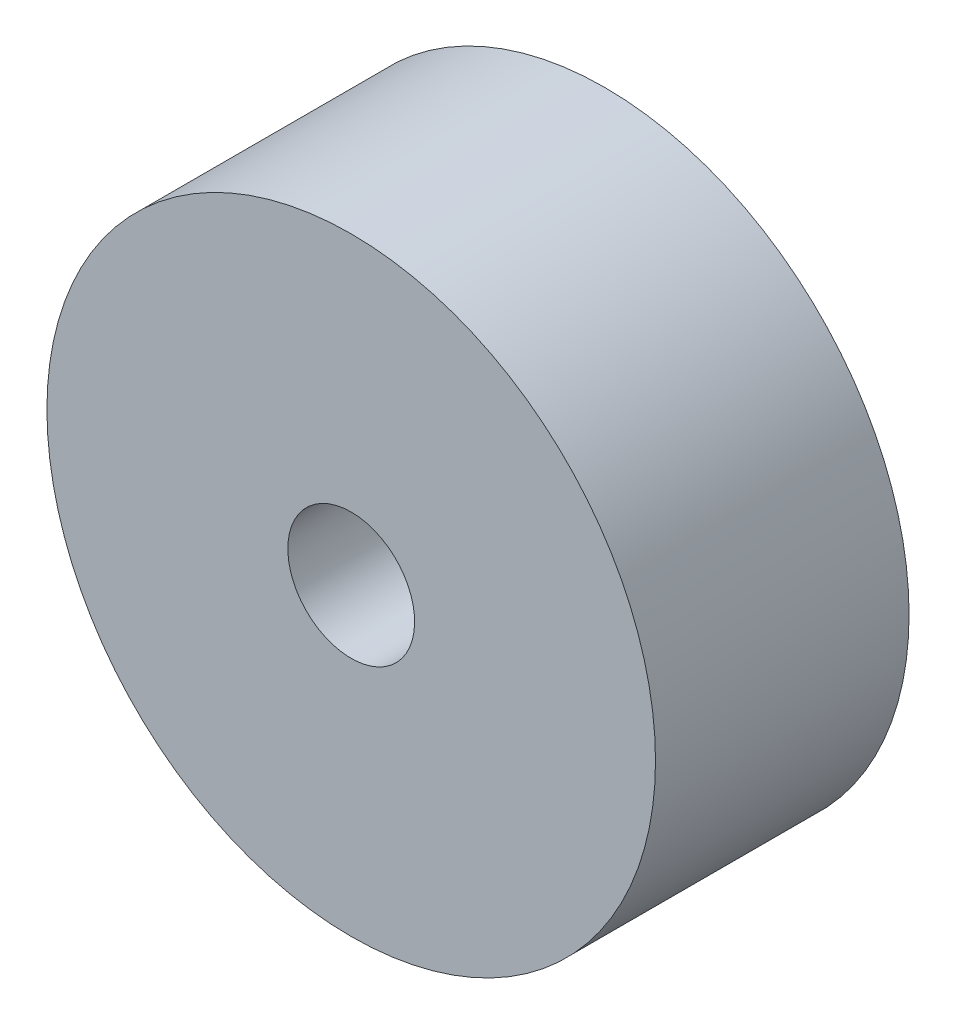
ISO-10303-21;
HEADER;
FILE_DESCRIPTION(('STEP AP214'),'2;1');
FILE_NAME('part.step','',(''),(''),'','','');
FILE_SCHEMA(('AUTOMOTIVE_DESIGN { 1 0 10303 214 1 1 1 1 }'));
ENDSEC;
DATA;
#1=APPLICATION_CONTEXT('core data for automotive mechanical design processes');
#2=APPLICATION_PROTOCOL_DEFINITION('international standard','automotive_design',2000,#1);
#3=PRODUCT_CONTEXT('',#1,'mechanical');
#4=PRODUCT('Part','Part','',(#3));
#5=PRODUCT_RELATED_PRODUCT_CATEGORY('part','',(#4));
#6=PRODUCT_DEFINITION_FORMATION('','',#4);
#7=PRODUCT_DEFINITION_CONTEXT('part definition',#1,'design');
#8=PRODUCT_DEFINITION('design','',#6,#7);
#9=PRODUCT_DEFINITION_SHAPE('','',#8);
#10=(LENGTH_UNIT() NAMED_UNIT(*) SI_UNIT(.MILLI.,.METRE.));
#11=(NAMED_UNIT(*) PLANE_ANGLE_UNIT() SI_UNIT($,.RADIAN.));
#12=(NAMED_UNIT(*) SI_UNIT($,.STERADIAN.) SOLID_ANGLE_UNIT());
#13=UNCERTAINTY_MEASURE_WITH_UNIT(LENGTH_MEASURE(1.E-05),#10,'distance_accuracy_value','');
#14=(GEOMETRIC_REPRESENTATION_CONTEXT(3) GLOBAL_UNCERTAINTY_ASSIGNED_CONTEXT((#13)) GLOBAL_UNIT_ASSIGNED_CONTEXT((#10,
#11,#12)) REPRESENTATION_CONTEXT('',''));
#15=CARTESIAN_POINT('',(0.,0.,0.));
#16=DIRECTION('',(0.,0.,1.));
#17=DIRECTION('',(1.,0.,0.));
#18=AXIS2_PLACEMENT_3D('',#15,#16,#17);
#19=CARTESIAN_POINT('',(-1.,0.,12.5));
#20=DIRECTION('',(0.,0.,-1.));
#21=DIRECTION('',(0.,1.,0.));
#22=AXIS2_PLACEMENT_3D('',#19,#20,#21);
#23=CYLINDRICAL_SURFACE('',#22,2.5);
#24=CARTESIAN_POINT('',(-0.999999999999999,0.,2.5));
#25=DIRECTION('',(0.,0.,-1.));
#26=DIRECTION('',(0.,1.,0.));
#27=AXIS2_PLACEMENT_3D('',#24,#25,#26);
#28=CIRCLE('',#27,2.5);
#29=CARTESIAN_POINT('',(-0.999999999999999,2.5,2.5));
#30=VERTEX_POINT('',#29);
#31=EDGE_CURVE('E10',#30,#30,#28,.T.);
#32=ORIENTED_EDGE('',*,*,#31,.T.);
#33=EDGE_LOOP('',(#32));
#34=FACE_BOUND('',#33,.T.);
#35=CARTESIAN_POINT('',(-1.,0.,12.5));
#36=DIRECTION('',(0.,0.,-1.));
#37=DIRECTION('',(0.,1.,0.));
#38=AXIS2_PLACEMENT_3D('',#35,#36,#37);
#39=CIRCLE('',#38,2.5);
#40=CARTESIAN_POINT('',(-1.,2.5,12.5));
#41=VERTEX_POINT('',#40);
#42=EDGE_CURVE('E46',#41,#41,#39,.T.);
#43=ORIENTED_EDGE('',*,*,#42,.F.);
#44=EDGE_LOOP('',(#43));
#45=FACE_BOUND('',#44,.T.);
#46=ADVANCED_FACE('F32',(#34,#45),#23,.F.);
#47=CARTESIAN_POINT('',(1.5,0.,2.5));
#48=DIRECTION('',(0.,0.,-1.));
#49=DIRECTION('',(0.,1.,0.));
#50=AXIS2_PLACEMENT_3D('',#47,#48,#49);
#51=PLANE('',#50);
#52=CARTESIAN_POINT('',(-0.999999999999999,0.,2.5));
#53=DIRECTION('',(0.,0.,-1.));
#54=DIRECTION('',(0.,1.,0.));
#55=AXIS2_PLACEMENT_3D('',#52,#53,#54);
#56=CIRCLE('',#55,12.);
#57=CARTESIAN_POINT('',(-0.999999999999999,12.,2.5));
#58=VERTEX_POINT('',#57);
#59=EDGE_CURVE('E38',#58,#58,#56,.T.);
#60=ORIENTED_EDGE('',*,*,#59,.T.);
#61=EDGE_LOOP('',(#60));
#62=FACE_BOUND('',#61,.T.);
#63=ORIENTED_EDGE('',*,*,#31,.F.);
#64=EDGE_LOOP('',(#63));
#65=FACE_BOUND('',#64,.T.);
#66=ADVANCED_FACE('F56',(#62,#65),#51,.T.);
#67=CARTESIAN_POINT('',(-1.,0.,12.5));
#68=DIRECTION('',(0.,0.,-1.));
#69=DIRECTION('',(0.,1.,0.));
#70=AXIS2_PLACEMENT_3D('',#67,#68,#69);
#71=CYLINDRICAL_SURFACE('',#70,12.);
#72=CARTESIAN_POINT('',(-1.,0.,12.5));
#73=DIRECTION('',(0.,0.,-1.));
#74=DIRECTION('',(0.,1.,0.));
#75=AXIS2_PLACEMENT_3D('',#72,#73,#74);
#76=CIRCLE('',#75,12.);
#77=CARTESIAN_POINT('',(-1.,12.,12.5));
#78=VERTEX_POINT('',#77);
#79=EDGE_CURVE('E42',#78,#78,#76,.T.);
#80=ORIENTED_EDGE('',*,*,#79,.T.);
#81=EDGE_LOOP('',(#80));
#82=FACE_BOUND('',#81,.T.);
#83=ORIENTED_EDGE('',*,*,#59,.F.);
#84=EDGE_LOOP('',(#83));
#85=FACE_BOUND('',#84,.T.);
#86=ADVANCED_FACE('F60',(#82,#85),#71,.T.);
#87=CARTESIAN_POINT('',(11.,0.,12.5));
#88=DIRECTION('',(0.,0.,1.));
#89=DIRECTION('',(0.,-1.,0.));
#90=AXIS2_PLACEMENT_3D('',#87,#88,#89);
#91=PLANE('',#90);
#92=ORIENTED_EDGE('',*,*,#42,.T.);
#93=EDGE_LOOP('',(#92));
#94=FACE_BOUND('',#93,.T.);
#95=ORIENTED_EDGE('',*,*,#79,.F.);
#96=EDGE_LOOP('',(#95));
#97=FACE_BOUND('',#96,.T.);
#98=ADVANCED_FACE('F52',(#94,#97),#91,.T.);
#99=CLOSED_SHELL('',(#46,#66,#86,#98));
#100=MANIFOLD_SOLID_BREP('B2',#99);
#101=ADVANCED_BREP_SHAPE_REPRESENTATION('',(#18,#100),#14);
#102=SHAPE_DEFINITION_REPRESENTATION(#9,#101);
ENDSEC;
END-ISO-10303-21;
